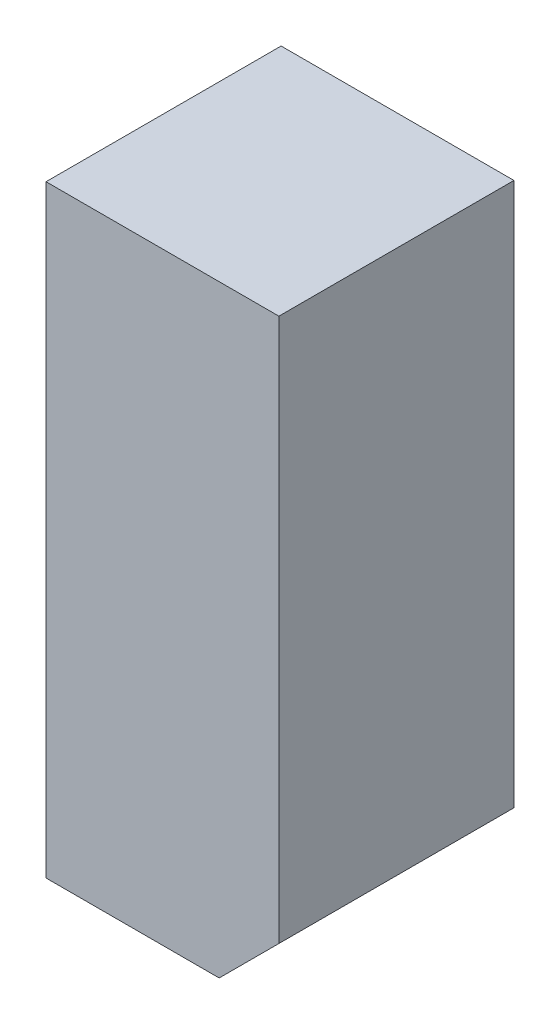
ISO-10303-21;
HEADER;
FILE_DESCRIPTION(('STEP AP214'),'2;1');
FILE_NAME('part.step','',(''),(''),'','','');
FILE_SCHEMA(('AUTOMOTIVE_DESIGN { 1 0 10303 214 1 1 1 1 }'));
ENDSEC;
DATA;
#1=APPLICATION_CONTEXT('core data for automotive mechanical design processes');
#2=APPLICATION_PROTOCOL_DEFINITION('international standard','automotive_design',2000,#1);
#3=PRODUCT_CONTEXT('',#1,'mechanical');
#4=PRODUCT('Part','Part','',(#3));
#5=PRODUCT_RELATED_PRODUCT_CATEGORY('part','',(#4));
#6=PRODUCT_DEFINITION_FORMATION('','',#4);
#7=PRODUCT_DEFINITION_CONTEXT('part definition',#1,'design');
#8=PRODUCT_DEFINITION('design','',#6,#7);
#9=PRODUCT_DEFINITION_SHAPE('','',#8);
#10=(LENGTH_UNIT() NAMED_UNIT(*) SI_UNIT(.MILLI.,.METRE.));
#11=(NAMED_UNIT(*) PLANE_ANGLE_UNIT() SI_UNIT($,.RADIAN.));
#12=(NAMED_UNIT(*) SI_UNIT($,.STERADIAN.) SOLID_ANGLE_UNIT());
#13=UNCERTAINTY_MEASURE_WITH_UNIT(LENGTH_MEASURE(1.E-05),#10,'distance_accuracy_value','');
#14=(GEOMETRIC_REPRESENTATION_CONTEXT(3) GLOBAL_UNCERTAINTY_ASSIGNED_CONTEXT((#13)) GLOBAL_UNIT_ASSIGNED_CONTEXT((#10,
#11,#12)) REPRESENTATION_CONTEXT('',''));
#15=CARTESIAN_POINT('',(0.,0.,0.));
#16=DIRECTION('',(0.,0.,1.));
#17=DIRECTION('',(1.,0.,0.));
#18=AXIS2_PLACEMENT_3D('',#15,#16,#17);
#19=CARTESIAN_POINT('',(2.4765,-5.1435,0.));
#20=DIRECTION('',(0.707106781186548,-0.707106781186548,0.));
#21=DIRECTION('',(0.707106781186548,0.707106781186548,0.));
#22=AXIS2_PLACEMENT_3D('',#19,#20,#21);
#23=PLANE('',#22);
#24=DIRECTION('',(0.,0.,-1.));
#25=VECTOR('',#24,1.);
#26=CARTESIAN_POINT('',(1.2065,-6.4135,0.));
#27=LINE('',#26,#25);
#28=CARTESIAN_POINT('',(1.2065,-6.4135,0.));
#29=VERTEX_POINT('',#28);
#30=CARTESIAN_POINT('',(1.2065,-6.4135,5.));
#31=VERTEX_POINT('',#30);
#32=EDGE_CURVE('E66',#29,#31,#27,.F.);
#33=ORIENTED_EDGE('',*,*,#32,.F.);
#34=DIRECTION('',(0.707106781186548,0.707106781186547,0.));
#35=VECTOR('',#34,1.);
#36=CARTESIAN_POINT('',(1.2065,-6.4135,0.));
#37=LINE('',#36,#35);
#38=CARTESIAN_POINT('',(2.4765,-5.1435,0.));
#39=VERTEX_POINT('',#38);
#40=EDGE_CURVE('E92',#29,#39,#37,.T.);
#41=ORIENTED_EDGE('',*,*,#40,.T.);
#42=DIRECTION('',(0.,0.,-1.));
#43=VECTOR('',#42,1.);
#44=CARTESIAN_POINT('',(2.4765,-5.1435,0.));
#45=LINE('',#44,#43);
#46=CARTESIAN_POINT('',(2.4765,-5.1435,5.));
#47=VERTEX_POINT('',#46);
#48=EDGE_CURVE('E20',#47,#39,#45,.T.);
#49=ORIENTED_EDGE('',*,*,#48,.F.);
#50=DIRECTION('',(0.707106781186548,0.707106781186547,0.));
#51=VECTOR('',#50,1.);
#52=CARTESIAN_POINT('',(1.2065,-6.4135,5.));
#53=LINE('',#52,#51);
#54=EDGE_CURVE('E75',#31,#47,#53,.T.);
#55=ORIENTED_EDGE('',*,*,#54,.F.);
#56=EDGE_LOOP('',(#33,#41,#49,#55));
#57=FACE_BOUND('',#56,.T.);
#58=ADVANCED_FACE('F17',(#57),#23,.T.);
#59=CARTESIAN_POINT('',(2.4765,6.4135,0.));
#60=DIRECTION('',(1.,0.,0.));
#61=DIRECTION('',(0.,0.,-1.));
#62=AXIS2_PLACEMENT_3D('',#59,#60,#61);
#63=PLANE('',#62);
#64=ORIENTED_EDGE('',*,*,#48,.T.);
#65=DIRECTION('',(0.,1.,0.));
#66=VECTOR('',#65,1.);
#67=CARTESIAN_POINT('',(2.4765,-6.4135,0.));
#68=LINE('',#67,#66);
#69=CARTESIAN_POINT('',(2.4765,6.4135,0.));
#70=VERTEX_POINT('',#69);
#71=EDGE_CURVE('E94',#39,#70,#68,.T.);
#72=ORIENTED_EDGE('',*,*,#71,.T.);
#73=DIRECTION('',(0.,0.,1.));
#74=VECTOR('',#73,1.);
#75=CARTESIAN_POINT('',(2.4765,6.4135,0.));
#76=LINE('',#75,#74);
#77=CARTESIAN_POINT('',(2.4765,6.4135,5.));
#78=VERTEX_POINT('',#77);
#79=EDGE_CURVE('E89',#78,#70,#76,.F.);
#80=ORIENTED_EDGE('',*,*,#79,.F.);
#81=DIRECTION('',(0.,1.,0.));
#82=VECTOR('',#81,1.);
#83=CARTESIAN_POINT('',(2.4765,-6.4135,5.));
#84=LINE('',#83,#82);
#85=EDGE_CURVE('E77',#47,#78,#84,.T.);
#86=ORIENTED_EDGE('',*,*,#85,.F.);
#87=EDGE_LOOP('',(#64,#72,#80,#86));
#88=FACE_BOUND('',#87,.T.);
#89=ADVANCED_FACE('F106',(#88),#63,.T.);
#90=CARTESIAN_POINT('',(1.2065,-6.4135,0.));
#91=DIRECTION('',(0.,-1.,0.));
#92=DIRECTION('',(0.,0.,-1.));
#93=AXIS2_PLACEMENT_3D('',#90,#91,#92);
#94=PLANE('',#93);
#95=DIRECTION('',(0.,0.,1.));
#96=VECTOR('',#95,1.);
#97=CARTESIAN_POINT('',(-2.4765,-6.4135,0.));
#98=LINE('',#97,#96);
#99=CARTESIAN_POINT('',(-2.4765,-6.4135,0.));
#100=VERTEX_POINT('',#99);
#101=CARTESIAN_POINT('',(-2.4765,-6.4135,5.));
#102=VERTEX_POINT('',#101);
#103=EDGE_CURVE('E97',#100,#102,#98,.T.);
#104=ORIENTED_EDGE('',*,*,#103,.F.);
#105=DIRECTION('',(1.,0.,0.));
#106=VECTOR('',#105,1.);
#107=CARTESIAN_POINT('',(-2.4765,-6.4135,0.));
#108=LINE('',#107,#106);
#109=EDGE_CURVE('E72',#100,#29,#108,.T.);
#110=ORIENTED_EDGE('',*,*,#109,.T.);
#111=ORIENTED_EDGE('',*,*,#32,.T.);
#112=DIRECTION('',(1.,0.,0.));
#113=VECTOR('',#112,1.);
#114=CARTESIAN_POINT('',(-2.4765,-6.4135,5.));
#115=LINE('',#114,#113);
#116=EDGE_CURVE('E69',#102,#31,#115,.T.);
#117=ORIENTED_EDGE('',*,*,#116,.F.);
#118=EDGE_LOOP('',(#104,#110,#111,#117));
#119=FACE_BOUND('',#118,.T.);
#120=ADVANCED_FACE('F67',(#119),#94,.T.);
#121=CARTESIAN_POINT('',(-2.4765,-6.4135,5.));
#122=DIRECTION('',(0.,0.,1.));
#123=DIRECTION('',(1.,0.,0.));
#124=AXIS2_PLACEMENT_3D('',#121,#122,#123);
#125=PLANE('',#124);
#126=DIRECTION('',(1.,0.,0.));
#127=VECTOR('',#126,1.);
#128=CARTESIAN_POINT('',(-2.4765,6.4135,5.));
#129=LINE('',#128,#127);
#130=CARTESIAN_POINT('',(-2.4765,6.4135,5.));
#131=VERTEX_POINT('',#130);
#132=EDGE_CURVE('E86',#131,#78,#129,.T.);
#133=ORIENTED_EDGE('',*,*,#132,.F.);
#134=DIRECTION('',(0.,1.,0.));
#135=VECTOR('',#134,1.);
#136=CARTESIAN_POINT('',(-2.4765,-6.4135,5.));
#137=LINE('',#136,#135);
#138=EDGE_CURVE('E81',#102,#131,#137,.T.);
#139=ORIENTED_EDGE('',*,*,#138,.F.);
#140=ORIENTED_EDGE('',*,*,#116,.T.);
#141=ORIENTED_EDGE('',*,*,#54,.T.);
#142=ORIENTED_EDGE('',*,*,#85,.T.);
#143=EDGE_LOOP('',(#133,#139,#140,#141,#142));
#144=FACE_BOUND('',#143,.T.);
#145=ADVANCED_FACE('F79',(#144),#125,.T.);
#146=CARTESIAN_POINT('',(-2.4765,6.4135,0.));
#147=DIRECTION('',(0.,1.,0.));
#148=DIRECTION('',(0.,0.,1.));
#149=AXIS2_PLACEMENT_3D('',#146,#147,#148);
#150=PLANE('',#149);
#151=ORIENTED_EDGE('',*,*,#79,.T.);
#152=DIRECTION('',(1.,0.,0.));
#153=VECTOR('',#152,1.);
#154=CARTESIAN_POINT('',(-2.4765,6.4135,0.));
#155=LINE('',#154,#153);
#156=CARTESIAN_POINT('',(-2.4765,6.4135,0.));
#157=VERTEX_POINT('',#156);
#158=EDGE_CURVE('E35',#70,#157,#155,.F.);
#159=ORIENTED_EDGE('',*,*,#158,.T.);
#160=DIRECTION('',(0.,0.,1.));
#161=VECTOR('',#160,1.);
#162=CARTESIAN_POINT('',(-2.4765,6.4135,0.));
#163=LINE('',#162,#161);
#164=EDGE_CURVE('E26',#131,#157,#163,.F.);
#165=ORIENTED_EDGE('',*,*,#164,.F.);
#166=ORIENTED_EDGE('',*,*,#132,.T.);
#167=EDGE_LOOP('',(#151,#159,#165,#166));
#168=FACE_BOUND('',#167,.T.);
#169=ADVANCED_FACE('F103',(#168),#150,.T.);
#170=CARTESIAN_POINT('',(-2.4765,-6.4135,0.));
#171=DIRECTION('',(0.,0.,1.));
#172=DIRECTION('',(1.,0.,0.));
#173=AXIS2_PLACEMENT_3D('',#170,#171,#172);
#174=PLANE('',#173);
#175=ORIENTED_EDGE('',*,*,#158,.F.);
#176=ORIENTED_EDGE('',*,*,#71,.F.);
#177=ORIENTED_EDGE('',*,*,#40,.F.);
#178=ORIENTED_EDGE('',*,*,#109,.F.);
#179=DIRECTION('',(0.,1.,0.));
#180=VECTOR('',#179,1.);
#181=CARTESIAN_POINT('',(-2.4765,-6.4135,0.));
#182=LINE('',#181,#180);
#183=EDGE_CURVE('E11',#157,#100,#182,.F.);
#184=ORIENTED_EDGE('',*,*,#183,.F.);
#185=EDGE_LOOP('',(#175,#176,#177,#178,#184));
#186=FACE_BOUND('',#185,.T.);
#187=ADVANCED_FACE('F109',(#186),#174,.F.);
#188=CARTESIAN_POINT('',(-2.4765,-6.4135,0.));
#189=DIRECTION('',(-1.,0.,0.));
#190=DIRECTION('',(0.,0.,1.));
#191=AXIS2_PLACEMENT_3D('',#188,#189,#190);
#192=PLANE('',#191);
#193=ORIENTED_EDGE('',*,*,#164,.T.);
#194=ORIENTED_EDGE('',*,*,#183,.T.);
#195=ORIENTED_EDGE('',*,*,#103,.T.);
#196=ORIENTED_EDGE('',*,*,#138,.T.);
#197=EDGE_LOOP('',(#193,#194,#195,#196));
#198=FACE_BOUND('',#197,.T.);
#199=ADVANCED_FACE('F102',(#198),#192,.T.);
#200=CLOSED_SHELL('',(#58,#89,#120,#145,#169,#187,#199));
#201=MANIFOLD_SOLID_BREP('B1',#200);
#202=ADVANCED_BREP_SHAPE_REPRESENTATION('',(#18,#201),#14);
#203=SHAPE_DEFINITION_REPRESENTATION(#9,#202);
ENDSEC;
END-ISO-10303-21;
